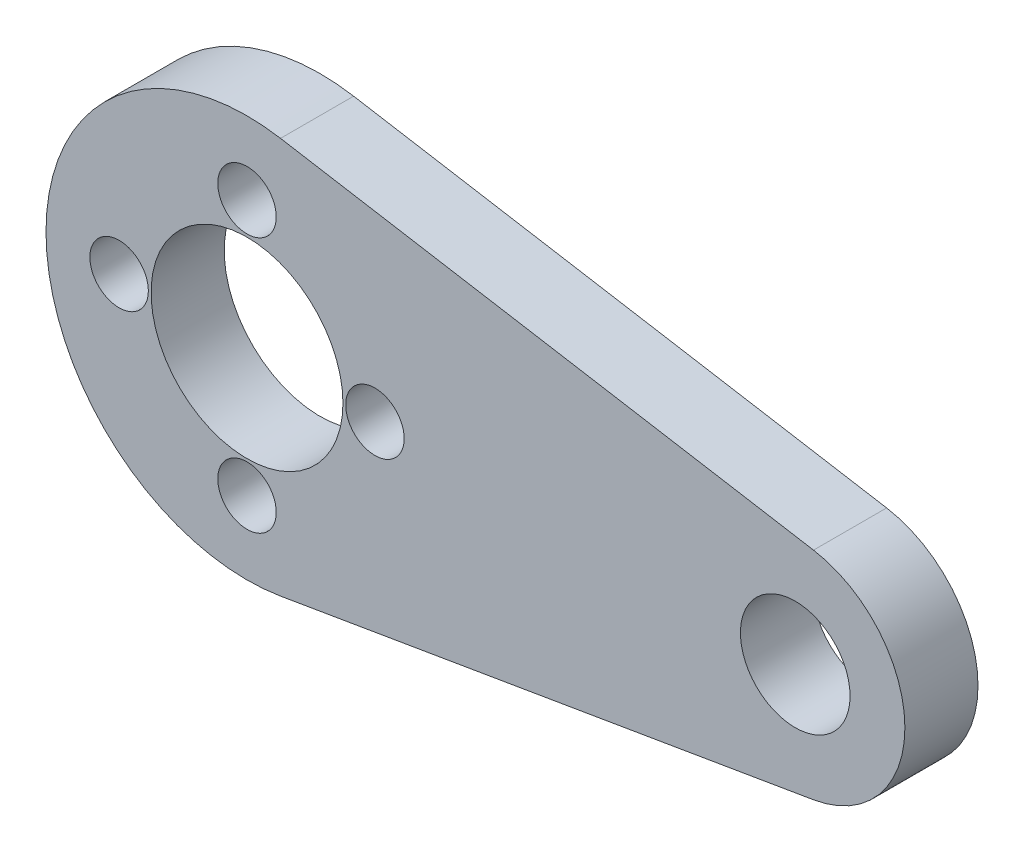
ISO-10303-21;
HEADER;
FILE_DESCRIPTION(('STEP AP214'),'2;1');
FILE_NAME('part.step','',(''),(''),'','','');
FILE_SCHEMA(('AUTOMOTIVE_DESIGN { 1 0 10303 214 1 1 1 1 }'));
ENDSEC;
DATA;
#1=APPLICATION_CONTEXT('core data for automotive mechanical design processes');
#2=APPLICATION_PROTOCOL_DEFINITION('international standard','automotive_design',2000,#1);
#3=PRODUCT_CONTEXT('',#1,'mechanical');
#4=PRODUCT('Part','Part','',(#3));
#5=PRODUCT_RELATED_PRODUCT_CATEGORY('part','',(#4));
#6=PRODUCT_DEFINITION_FORMATION('','',#4);
#7=PRODUCT_DEFINITION_CONTEXT('part definition',#1,'design');
#8=PRODUCT_DEFINITION('design','',#6,#7);
#9=PRODUCT_DEFINITION_SHAPE('','',#8);
#10=(LENGTH_UNIT() NAMED_UNIT(*) SI_UNIT(.MILLI.,.METRE.));
#11=(NAMED_UNIT(*) PLANE_ANGLE_UNIT() SI_UNIT($,.RADIAN.));
#12=(NAMED_UNIT(*) SI_UNIT($,.STERADIAN.) SOLID_ANGLE_UNIT());
#13=UNCERTAINTY_MEASURE_WITH_UNIT(LENGTH_MEASURE(1.E-05),#10,'distance_accuracy_value','');
#14=(GEOMETRIC_REPRESENTATION_CONTEXT(3) GLOBAL_UNCERTAINTY_ASSIGNED_CONTEXT((#13)) GLOBAL_UNIT_ASSIGNED_CONTEXT((#10,
#11,#12)) REPRESENTATION_CONTEXT('',''));
#15=CARTESIAN_POINT('',(0.,0.,0.));
#16=DIRECTION('',(0.,0.,1.));
#17=DIRECTION('',(1.,0.,0.));
#18=AXIS2_PLACEMENT_3D('',#15,#16,#17);
#19=CARTESIAN_POINT('',(0.,0.,4.));
#20=DIRECTION('',(0.,0.,1.));
#21=DIRECTION('',(1.,0.,0.));
#22=AXIS2_PLACEMENT_3D('',#19,#20,#21);
#23=PLANE('',#22);
#24=CARTESIAN_POINT('',(0.,0.,4.));
#25=DIRECTION('',(0.,0.,1.));
#26=DIRECTION('',(1.,0.,0.));
#27=AXIS2_PLACEMENT_3D('',#24,#25,#26);
#28=CIRCLE('',#27,5.25);
#29=CARTESIAN_POINT('',(5.25,0.,4.));
#30=VERTEX_POINT('',#29);
#31=EDGE_CURVE('E145',#30,#30,#28,.T.);
#32=ORIENTED_EDGE('',*,*,#31,.F.);
#33=EDGE_LOOP('',(#32));
#34=FACE_BOUND('',#33,.T.);
#35=CARTESIAN_POINT('',(0.,-7.,4.));
#36=DIRECTION('',(0.,0.,1.));
#37=DIRECTION('',(1.,0.,0.));
#38=AXIS2_PLACEMENT_3D('',#35,#36,#37);
#39=CIRCLE('',#38,1.6);
#40=CARTESIAN_POINT('',(1.6,-7.,4.));
#41=VERTEX_POINT('',#40);
#42=EDGE_CURVE('E130',#41,#41,#39,.T.);
#43=ORIENTED_EDGE('',*,*,#42,.F.);
#44=EDGE_LOOP('',(#43));
#45=FACE_BOUND('',#44,.T.);
#46=CARTESIAN_POINT('',(0.,7.,4.));
#47=DIRECTION('',(0.,0.,1.));
#48=DIRECTION('',(1.,0.,0.));
#49=AXIS2_PLACEMENT_3D('',#46,#47,#48);
#50=CIRCLE('',#49,1.6);
#51=CARTESIAN_POINT('',(1.6,7.,4.));
#52=VERTEX_POINT('',#51);
#53=EDGE_CURVE('E118',#52,#52,#50,.T.);
#54=ORIENTED_EDGE('',*,*,#53,.F.);
#55=EDGE_LOOP('',(#54));
#56=FACE_BOUND('',#55,.T.);
#57=CARTESIAN_POINT('',(0.,0.,4.));
#58=DIRECTION('',(0.,0.,1.));
#59=DIRECTION('',(1.,0.,0.));
#60=AXIS2_PLACEMENT_3D('',#57,#58,#59);
#61=CIRCLE('',#60,11.);
#62=CARTESIAN_POINT('',(1.83333333333333,10.846146269016,4.));
#63=VERTEX_POINT('',#62);
#64=CARTESIAN_POINT('',(1.83333333333333,-10.846146269016,4.));
#65=VERTEX_POINT('',#64);
#66=EDGE_CURVE('E88',#63,#65,#61,.T.);
#67=ORIENTED_EDGE('',*,*,#66,.T.);
#68=DIRECTION('',(0.986013297183269,0.166666666666667,0.));
#69=VECTOR('',#68,1.);
#70=CARTESIAN_POINT('',(1.83333333333333,-10.846146269016,4.));
#71=LINE('',#70,#69);
#72=CARTESIAN_POINT('',(31.,-5.91607978309962,4.));
#73=VERTEX_POINT('',#72);
#74=EDGE_CURVE('E83',#65,#73,#71,.T.);
#75=ORIENTED_EDGE('',*,*,#74,.T.);
#76=CARTESIAN_POINT('',(30.,0.,4.));
#77=DIRECTION('',(0.,0.,1.));
#78=DIRECTION('',(-1.,0.,0.));
#79=AXIS2_PLACEMENT_3D('',#76,#77,#78);
#80=CIRCLE('',#79,6.);
#81=CARTESIAN_POINT('',(31.,5.91607978309962,4.));
#82=VERTEX_POINT('',#81);
#83=EDGE_CURVE('E86',#73,#82,#80,.T.);
#84=ORIENTED_EDGE('',*,*,#83,.T.);
#85=DIRECTION('',(-0.986013297183269,0.166666666666667,0.));
#86=VECTOR('',#85,1.);
#87=CARTESIAN_POINT('',(1.83333333333333,10.846146269016,4.));
#88=LINE('',#87,#86);
#89=EDGE_CURVE('E53',#82,#63,#88,.T.);
#90=ORIENTED_EDGE('',*,*,#89,.T.);
#91=EDGE_LOOP('',(#67,#75,#84,#90));
#92=FACE_BOUND('',#91,.T.);
#93=CARTESIAN_POINT('',(30.,0.,4.));
#94=DIRECTION('',(0.,0.,1.));
#95=DIRECTION('',(1.,0.,0.));
#96=AXIS2_PLACEMENT_3D('',#93,#94,#95);
#97=CIRCLE('',#96,3.00000000000001);
#98=CARTESIAN_POINT('',(33.,0.,4.));
#99=VERTEX_POINT('',#98);
#100=EDGE_CURVE('E103',#99,#99,#97,.T.);
#101=ORIENTED_EDGE('',*,*,#100,.F.);
#102=EDGE_LOOP('',(#101));
#103=FACE_BOUND('',#102,.T.);
#104=CARTESIAN_POINT('',(-7.,0.,4.));
#105=DIRECTION('',(0.,0.,1.));
#106=DIRECTION('',(1.,0.,0.));
#107=AXIS2_PLACEMENT_3D('',#104,#105,#106);
#108=CIRCLE('',#107,1.6);
#109=CARTESIAN_POINT('',(-5.4,0.,4.));
#110=VERTEX_POINT('',#109);
#111=EDGE_CURVE('E124',#110,#110,#108,.T.);
#112=ORIENTED_EDGE('',*,*,#111,.F.);
#113=EDGE_LOOP('',(#112));
#114=FACE_BOUND('',#113,.T.);
#115=CARTESIAN_POINT('',(7.,0.,4.));
#116=DIRECTION('',(0.,0.,1.));
#117=DIRECTION('',(1.,0.,0.));
#118=AXIS2_PLACEMENT_3D('',#115,#116,#117);
#119=CIRCLE('',#118,1.6);
#120=CARTESIAN_POINT('',(8.6,0.,4.));
#121=VERTEX_POINT('',#120);
#122=EDGE_CURVE('E136',#121,#121,#119,.T.);
#123=ORIENTED_EDGE('',*,*,#122,.F.);
#124=EDGE_LOOP('',(#123));
#125=FACE_BOUND('',#124,.T.);
#126=ADVANCED_FACE('F36',(#34,#45,#56,#92,#103,#114,#125),#23,.T.);
#127=CARTESIAN_POINT('',(0.,0.,0.));
#128=DIRECTION('',(0.,0.,1.));
#129=DIRECTION('',(1.,0.,0.));
#130=AXIS2_PLACEMENT_3D('',#127,#128,#129);
#131=PLANE('',#130);
#132=CARTESIAN_POINT('',(0.,0.,0.));
#133=DIRECTION('',(0.,0.,1.));
#134=DIRECTION('',(1.,0.,0.));
#135=AXIS2_PLACEMENT_3D('',#132,#133,#134);
#136=CIRCLE('',#135,5.25);
#137=CARTESIAN_POINT('',(5.25,0.,0.));
#138=VERTEX_POINT('',#137);
#139=EDGE_CURVE('E142',#138,#138,#136,.T.);
#140=ORIENTED_EDGE('',*,*,#139,.T.);
#141=EDGE_LOOP('',(#140));
#142=FACE_BOUND('',#141,.T.);
#143=CARTESIAN_POINT('',(0.,0.,0.));
#144=DIRECTION('',(0.,0.,1.));
#145=DIRECTION('',(1.,0.,0.));
#146=AXIS2_PLACEMENT_3D('',#143,#144,#145);
#147=CIRCLE('',#146,11.);
#148=CARTESIAN_POINT('',(1.83333333333333,10.846146269016,0.));
#149=VERTEX_POINT('',#148);
#150=CARTESIAN_POINT('',(1.83333333333333,-10.846146269016,0.));
#151=VERTEX_POINT('',#150);
#152=EDGE_CURVE('E100',#149,#151,#147,.T.);
#153=ORIENTED_EDGE('',*,*,#152,.F.);
#154=DIRECTION('',(-0.986013297183269,0.166666666666667,0.));
#155=VECTOR('',#154,1.);
#156=CARTESIAN_POINT('',(1.83333333333333,10.846146269016,0.));
#157=LINE('',#156,#155);
#158=CARTESIAN_POINT('',(31.,5.91607978309962,0.));
#159=VERTEX_POINT('',#158);
#160=EDGE_CURVE('E76',#159,#149,#157,.T.);
#161=ORIENTED_EDGE('',*,*,#160,.F.);
#162=CARTESIAN_POINT('',(30.,0.,0.));
#163=DIRECTION('',(0.,0.,1.));
#164=DIRECTION('',(-1.,0.,0.));
#165=AXIS2_PLACEMENT_3D('',#162,#163,#164);
#166=CIRCLE('',#165,6.);
#167=CARTESIAN_POINT('',(31.,-5.91607978309962,0.));
#168=VERTEX_POINT('',#167);
#169=EDGE_CURVE('E70',#168,#159,#166,.T.);
#170=ORIENTED_EDGE('',*,*,#169,.F.);
#171=DIRECTION('',(0.986013297183269,0.166666666666667,0.));
#172=VECTOR('',#171,1.);
#173=CARTESIAN_POINT('',(1.83333333333333,-10.846146269016,0.));
#174=LINE('',#173,#172);
#175=EDGE_CURVE('E92',#151,#168,#174,.T.);
#176=ORIENTED_EDGE('',*,*,#175,.F.);
#177=EDGE_LOOP('',(#153,#161,#170,#176));
#178=FACE_BOUND('',#177,.T.);
#179=CARTESIAN_POINT('',(30.,0.,0.));
#180=DIRECTION('',(0.,0.,1.));
#181=DIRECTION('',(1.,0.,0.));
#182=AXIS2_PLACEMENT_3D('',#179,#180,#181);
#183=CIRCLE('',#182,3.00000000000001);
#184=CARTESIAN_POINT('',(33.,0.,0.));
#185=VERTEX_POINT('',#184);
#186=EDGE_CURVE('E115',#185,#185,#183,.T.);
#187=ORIENTED_EDGE('',*,*,#186,.T.);
#188=EDGE_LOOP('',(#187));
#189=FACE_BOUND('',#188,.T.);
#190=CARTESIAN_POINT('',(0.,7.,0.));
#191=DIRECTION('',(0.,0.,1.));
#192=DIRECTION('',(1.,0.,0.));
#193=AXIS2_PLACEMENT_3D('',#190,#191,#192);
#194=CIRCLE('',#193,1.6);
#195=CARTESIAN_POINT('',(1.6,7.,0.));
#196=VERTEX_POINT('',#195);
#197=EDGE_CURVE('E121',#196,#196,#194,.T.);
#198=ORIENTED_EDGE('',*,*,#197,.T.);
#199=EDGE_LOOP('',(#198));
#200=FACE_BOUND('',#199,.T.);
#201=CARTESIAN_POINT('',(-7.,0.,0.));
#202=DIRECTION('',(0.,0.,1.));
#203=DIRECTION('',(1.,0.,0.));
#204=AXIS2_PLACEMENT_3D('',#201,#202,#203);
#205=CIRCLE('',#204,1.6);
#206=CARTESIAN_POINT('',(-5.4,0.,0.));
#207=VERTEX_POINT('',#206);
#208=EDGE_CURVE('E127',#207,#207,#205,.T.);
#209=ORIENTED_EDGE('',*,*,#208,.T.);
#210=EDGE_LOOP('',(#209));
#211=FACE_BOUND('',#210,.T.);
#212=CARTESIAN_POINT('',(0.,-7.,0.));
#213=DIRECTION('',(0.,0.,1.));
#214=DIRECTION('',(1.,0.,0.));
#215=AXIS2_PLACEMENT_3D('',#212,#213,#214);
#216=CIRCLE('',#215,1.6);
#217=CARTESIAN_POINT('',(1.6,-7.,0.));
#218=VERTEX_POINT('',#217);
#219=EDGE_CURVE('E133',#218,#218,#216,.T.);
#220=ORIENTED_EDGE('',*,*,#219,.T.);
#221=EDGE_LOOP('',(#220));
#222=FACE_BOUND('',#221,.T.);
#223=CARTESIAN_POINT('',(7.,0.,0.));
#224=DIRECTION('',(0.,0.,1.));
#225=DIRECTION('',(1.,0.,0.));
#226=AXIS2_PLACEMENT_3D('',#223,#224,#225);
#227=CIRCLE('',#226,1.6);
#228=CARTESIAN_POINT('',(8.6,0.,0.));
#229=VERTEX_POINT('',#228);
#230=EDGE_CURVE('E139',#229,#229,#227,.T.);
#231=ORIENTED_EDGE('',*,*,#230,.T.);
#232=EDGE_LOOP('',(#231));
#233=FACE_BOUND('',#232,.T.);
#234=ADVANCED_FACE('F111',(#142,#178,#189,#200,#211,#222,#233),#131,.F.);
#235=CARTESIAN_POINT('',(0.,0.,4.));
#236=DIRECTION('',(0.,0.,-1.));
#237=DIRECTION('',(-1.,0.,0.));
#238=AXIS2_PLACEMENT_3D('',#235,#236,#237);
#239=CYLINDRICAL_SURFACE('',#238,11.);
#240=ORIENTED_EDGE('',*,*,#152,.T.);
#241=DIRECTION('',(0.,0.,-1.));
#242=VECTOR('',#241,1.);
#243=CARTESIAN_POINT('',(1.83333333333333,-10.846146269016,4.));
#244=LINE('',#243,#242);
#245=EDGE_CURVE('E11',#65,#151,#244,.T.);
#246=ORIENTED_EDGE('',*,*,#245,.F.);
#247=ORIENTED_EDGE('',*,*,#66,.F.);
#248=DIRECTION('',(0.,0.,-1.));
#249=VECTOR('',#248,1.);
#250=CARTESIAN_POINT('',(1.83333333333333,10.846146269016,4.));
#251=LINE('',#250,#249);
#252=EDGE_CURVE('E96',#63,#149,#251,.T.);
#253=ORIENTED_EDGE('',*,*,#252,.T.);
#254=EDGE_LOOP('',(#240,#246,#247,#253));
#255=FACE_BOUND('',#254,.T.);
#256=ADVANCED_FACE('F38',(#255),#239,.T.);
#257=CARTESIAN_POINT('',(1.83333333333333,-10.846146269016,4.));
#258=DIRECTION('',(-0.166666666666667,0.986013297183269,0.));
#259=DIRECTION('',(-0.986013297183269,-0.166666666666667,0.));
#260=AXIS2_PLACEMENT_3D('',#257,#258,#259);
#261=PLANE('',#260);
#262=ORIENTED_EDGE('',*,*,#175,.T.);
#263=DIRECTION('',(0.,0.,-1.));
#264=VECTOR('',#263,1.);
#265=CARTESIAN_POINT('',(31.,-5.91607978309962,4.));
#266=LINE('',#265,#264);
#267=EDGE_CURVE('E45',#73,#168,#266,.T.);
#268=ORIENTED_EDGE('',*,*,#267,.F.);
#269=ORIENTED_EDGE('',*,*,#74,.F.);
#270=ORIENTED_EDGE('',*,*,#245,.T.);
#271=EDGE_LOOP('',(#262,#268,#269,#270));
#272=FACE_BOUND('',#271,.T.);
#273=ADVANCED_FACE('F91',(#272),#261,.F.);
#274=CARTESIAN_POINT('',(30.,0.,4.));
#275=DIRECTION('',(0.,0.,-1.));
#276=DIRECTION('',(-1.,0.,0.));
#277=AXIS2_PLACEMENT_3D('',#274,#275,#276);
#278=CYLINDRICAL_SURFACE('',#277,6.);
#279=ORIENTED_EDGE('',*,*,#169,.T.);
#280=DIRECTION('',(0.,0.,-1.));
#281=VECTOR('',#280,1.);
#282=CARTESIAN_POINT('',(31.,5.91607978309962,4.));
#283=LINE('',#282,#281);
#284=EDGE_CURVE('E93',#82,#159,#283,.T.);
#285=ORIENTED_EDGE('',*,*,#284,.F.);
#286=ORIENTED_EDGE('',*,*,#83,.F.);
#287=ORIENTED_EDGE('',*,*,#267,.T.);
#288=EDGE_LOOP('',(#279,#285,#286,#287));
#289=FACE_BOUND('',#288,.T.);
#290=ADVANCED_FACE('F94',(#289),#278,.T.);
#291=CARTESIAN_POINT('',(1.83333333333333,10.846146269016,4.));
#292=DIRECTION('',(-0.166666666666667,-0.986013297183269,0.));
#293=DIRECTION('',(0.986013297183269,-0.166666666666667,0.));
#294=AXIS2_PLACEMENT_3D('',#291,#292,#293);
#295=PLANE('',#294);
#296=ORIENTED_EDGE('',*,*,#160,.T.);
#297=ORIENTED_EDGE('',*,*,#252,.F.);
#298=ORIENTED_EDGE('',*,*,#89,.F.);
#299=ORIENTED_EDGE('',*,*,#284,.T.);
#300=EDGE_LOOP('',(#296,#297,#298,#299));
#301=FACE_BOUND('',#300,.T.);
#302=ADVANCED_FACE('F108',(#301),#295,.F.);
#303=CARTESIAN_POINT('',(30.,0.,4.));
#304=DIRECTION('',(0.,0.,-1.));
#305=DIRECTION('',(-1.,0.,0.));
#306=AXIS2_PLACEMENT_3D('',#303,#304,#305);
#307=CYLINDRICAL_SURFACE('',#306,3.00000000000001);
#308=ORIENTED_EDGE('',*,*,#100,.T.);
#309=EDGE_LOOP('',(#308));
#310=FACE_BOUND('',#309,.T.);
#311=ORIENTED_EDGE('',*,*,#186,.F.);
#312=EDGE_LOOP('',(#311));
#313=FACE_BOUND('',#312,.T.);
#314=ADVANCED_FACE('F170',(#310,#313),#307,.F.);
#315=CARTESIAN_POINT('',(0.,7.,4.));
#316=DIRECTION('',(0.,0.,-1.));
#317=DIRECTION('',(-1.,0.,0.));
#318=AXIS2_PLACEMENT_3D('',#315,#316,#317);
#319=CYLINDRICAL_SURFACE('',#318,1.6);
#320=ORIENTED_EDGE('',*,*,#53,.T.);
#321=EDGE_LOOP('',(#320));
#322=FACE_BOUND('',#321,.T.);
#323=ORIENTED_EDGE('',*,*,#197,.F.);
#324=EDGE_LOOP('',(#323));
#325=FACE_BOUND('',#324,.T.);
#326=ADVANCED_FACE('F166',(#322,#325),#319,.F.);
#327=CARTESIAN_POINT('',(-7.,0.,4.));
#328=DIRECTION('',(0.,0.,-1.));
#329=DIRECTION('',(-1.,0.,0.));
#330=AXIS2_PLACEMENT_3D('',#327,#328,#329);
#331=CYLINDRICAL_SURFACE('',#330,1.6);
#332=ORIENTED_EDGE('',*,*,#111,.T.);
#333=EDGE_LOOP('',(#332));
#334=FACE_BOUND('',#333,.T.);
#335=ORIENTED_EDGE('',*,*,#208,.F.);
#336=EDGE_LOOP('',(#335));
#337=FACE_BOUND('',#336,.T.);
#338=ADVANCED_FACE('F169',(#334,#337),#331,.F.);
#339=CARTESIAN_POINT('',(0.,-7.,4.));
#340=DIRECTION('',(0.,0.,-1.));
#341=DIRECTION('',(-1.,0.,0.));
#342=AXIS2_PLACEMENT_3D('',#339,#340,#341);
#343=CYLINDRICAL_SURFACE('',#342,1.6);
#344=ORIENTED_EDGE('',*,*,#42,.T.);
#345=EDGE_LOOP('',(#344));
#346=FACE_BOUND('',#345,.T.);
#347=ORIENTED_EDGE('',*,*,#219,.F.);
#348=EDGE_LOOP('',(#347));
#349=FACE_BOUND('',#348,.T.);
#350=ADVANCED_FACE('F184',(#346,#349),#343,.F.);
#351=CARTESIAN_POINT('',(7.,0.,4.));
#352=DIRECTION('',(0.,0.,-1.));
#353=DIRECTION('',(-1.,0.,0.));
#354=AXIS2_PLACEMENT_3D('',#351,#352,#353);
#355=CYLINDRICAL_SURFACE('',#354,1.6);
#356=ORIENTED_EDGE('',*,*,#122,.T.);
#357=EDGE_LOOP('',(#356));
#358=FACE_BOUND('',#357,.T.);
#359=ORIENTED_EDGE('',*,*,#230,.F.);
#360=EDGE_LOOP('',(#359));
#361=FACE_BOUND('',#360,.T.);
#362=ADVANCED_FACE('F155',(#358,#361),#355,.F.);
#363=CARTESIAN_POINT('',(0.,0.,0.));
#364=DIRECTION('',(0.,0.,1.));
#365=DIRECTION('',(1.,0.,0.));
#366=AXIS2_PLACEMENT_3D('',#363,#364,#365);
#367=CYLINDRICAL_SURFACE('',#366,5.25);
#368=ORIENTED_EDGE('',*,*,#139,.F.);
#369=EDGE_LOOP('',(#368));
#370=FACE_BOUND('',#369,.T.);
#371=ORIENTED_EDGE('',*,*,#31,.T.);
#372=EDGE_LOOP('',(#371));
#373=FACE_BOUND('',#372,.T.);
#374=ADVANCED_FACE('F152',(#370,#373),#367,.F.);
#375=CLOSED_SHELL('',(#126,#234,#256,#273,#290,#302,#314,#326,#338,#350,#362,#374));
#376=MANIFOLD_SOLID_BREP('B2',#375);
#377=ADVANCED_BREP_SHAPE_REPRESENTATION('',(#18,#376),#14);
#378=SHAPE_DEFINITION_REPRESENTATION(#9,#377);
ENDSEC;
END-ISO-10303-21;
